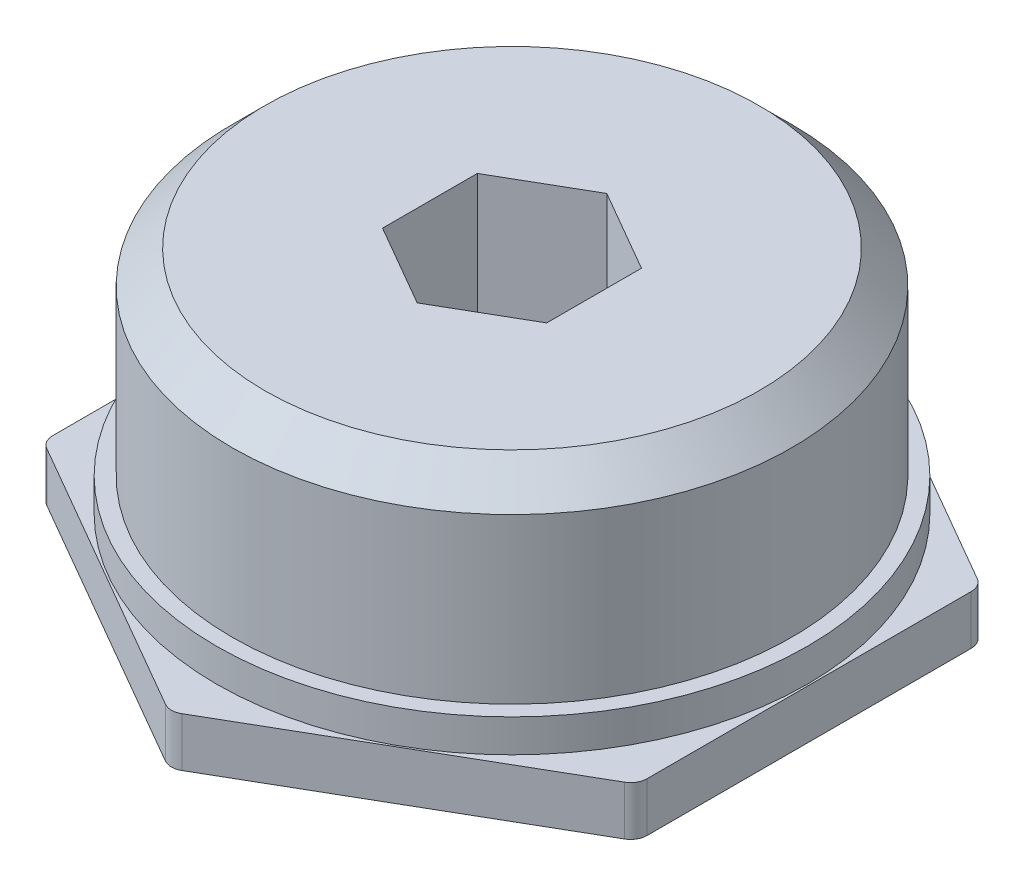
ISO-10303-21;
HEADER;
FILE_DESCRIPTION(('STEP AP214'),'2;1');
FILE_NAME('part.step','',(''),(''),'','','');
FILE_SCHEMA(('AUTOMOTIVE_DESIGN { 1 0 10303 214 1 1 1 1 }'));
ENDSEC;
DATA;
#1=APPLICATION_CONTEXT('core data for automotive mechanical design processes');
#2=APPLICATION_PROTOCOL_DEFINITION('international standard','automotive_design',2000,#1);
#3=PRODUCT_CONTEXT('',#1,'mechanical');
#4=PRODUCT('Part','Part','',(#3));
#5=PRODUCT_RELATED_PRODUCT_CATEGORY('part','',(#4));
#6=PRODUCT_DEFINITION_FORMATION('','',#4);
#7=PRODUCT_DEFINITION_CONTEXT('part definition',#1,'design');
#8=PRODUCT_DEFINITION('design','',#6,#7);
#9=PRODUCT_DEFINITION_SHAPE('','',#8);
#10=(LENGTH_UNIT() NAMED_UNIT(*) SI_UNIT(.MILLI.,.METRE.));
#11=(NAMED_UNIT(*) PLANE_ANGLE_UNIT() SI_UNIT($,.RADIAN.));
#12=(NAMED_UNIT(*) SI_UNIT($,.STERADIAN.) SOLID_ANGLE_UNIT());
#13=UNCERTAINTY_MEASURE_WITH_UNIT(LENGTH_MEASURE(1.E-05),#10,'distance_accuracy_value','');
#14=(GEOMETRIC_REPRESENTATION_CONTEXT(3) GLOBAL_UNCERTAINTY_ASSIGNED_CONTEXT((#13)) GLOBAL_UNIT_ASSIGNED_CONTEXT((#10,
#11,#12)) REPRESENTATION_CONTEXT('',''));
#15=CARTESIAN_POINT('',(0.,0.,0.));
#16=DIRECTION('',(0.,0.,1.));
#17=DIRECTION('',(1.,0.,0.));
#18=AXIS2_PLACEMENT_3D('',#15,#16,#17);
#19=CARTESIAN_POINT('',(0.,31.,0.));
#20=DIRECTION('',(0.,1.,0.));
#21=DIRECTION('',(0.,0.,1.));
#22=AXIS2_PLACEMENT_3D('',#19,#20,#21);
#23=PLANE('',#22);
#24=DIRECTION('',(-0.866025403784439,0.,0.5));
#25=VECTOR('',#24,1.);
#26=CARTESIAN_POINT('',(0.,31.,-10.4500398723322));
#27=LINE('',#26,#25);
#28=CARTESIAN_POINT('',(-0.250000000000002,31.,-10.3057023050348));
#29=VERTEX_POINT('',#28);
#30=CARTESIAN_POINT('',(-8.8,31.,-5.36935750346352));
#31=VERTEX_POINT('',#30);
#32=EDGE_CURVE('E253',#29,#31,#27,.T.);
#33=ORIENTED_EDGE('',*,*,#32,.F.);
#34=CARTESIAN_POINT('',(0.,31.,-9.8726896031426));
#35=DIRECTION('',(0.,1.,0.));
#36=DIRECTION('',(0.,0.,1.));
#37=AXIS2_PLACEMENT_3D('',#34,#35,#36);
#38=CIRCLE('',#37,0.5);
#39=CARTESIAN_POINT('',(0.249999999999997,31.,-10.3057023050348));
#40=VERTEX_POINT('',#39);
#41=EDGE_CURVE('E281',#29,#40,#38,.F.);
#42=ORIENTED_EDGE('',*,*,#41,.T.);
#43=DIRECTION('',(-0.866025403784439,0.,-0.5));
#44=VECTOR('',#43,1.);
#45=CARTESIAN_POINT('',(9.05,31.,-5.22501993616611));
#46=LINE('',#45,#44);
#47=CARTESIAN_POINT('',(8.8,31.,-5.36935750346352));
#48=VERTEX_POINT('',#47);
#49=EDGE_CURVE('E227',#48,#40,#46,.T.);
#50=ORIENTED_EDGE('',*,*,#49,.F.);
#51=CARTESIAN_POINT('',(8.55,31.,-4.9363448015713));
#52=DIRECTION('',(0.,1.,0.));
#53=DIRECTION('',(0.,0.,1.));
#54=AXIS2_PLACEMENT_3D('',#51,#52,#53);
#55=CIRCLE('',#54,0.5);
#56=CARTESIAN_POINT('',(9.05,31.,-4.9363448015713));
#57=VERTEX_POINT('',#56);
#58=EDGE_CURVE('E271',#48,#57,#55,.F.);
#59=ORIENTED_EDGE('',*,*,#58,.T.);
#60=DIRECTION('',(0.,0.,-1.));
#61=VECTOR('',#60,1.);
#62=CARTESIAN_POINT('',(9.05,31.,5.22501993616611));
#63=LINE('',#62,#61);
#64=CARTESIAN_POINT('',(9.05,31.,4.9363448015713));
#65=VERTEX_POINT('',#64);
#66=EDGE_CURVE('E235',#65,#57,#63,.T.);
#67=ORIENTED_EDGE('',*,*,#66,.F.);
#68=CARTESIAN_POINT('',(8.55,31.,4.9363448015713));
#69=DIRECTION('',(0.,1.,0.));
#70=DIRECTION('',(0.,0.,1.));
#71=AXIS2_PLACEMENT_3D('',#68,#69,#70);
#72=CIRCLE('',#71,0.5);
#73=CARTESIAN_POINT('',(8.8,31.,5.36935750346352));
#74=VERTEX_POINT('',#73);
#75=EDGE_CURVE('E273',#65,#74,#72,.F.);
#76=ORIENTED_EDGE('',*,*,#75,.T.);
#77=DIRECTION('',(0.866025403784439,0.,-0.5));
#78=VECTOR('',#77,1.);
#79=CARTESIAN_POINT('',(0.,31.,10.4500398723322));
#80=LINE('',#79,#78);
#81=CARTESIAN_POINT('',(0.249999999999999,31.,10.3057023050348));
#82=VERTEX_POINT('',#81);
#83=EDGE_CURVE('E262',#82,#74,#80,.T.);
#84=ORIENTED_EDGE('',*,*,#83,.F.);
#85=CARTESIAN_POINT('',(0.,31.,9.8726896031426));
#86=DIRECTION('',(0.,1.,0.));
#87=DIRECTION('',(0.,0.,1.));
#88=AXIS2_PLACEMENT_3D('',#85,#86,#87);
#89=CIRCLE('',#88,0.5);
#90=CARTESIAN_POINT('',(-0.249999999999999,31.,10.3057023050348));
#91=VERTEX_POINT('',#90);
#92=EDGE_CURVE('E275',#82,#91,#89,.F.);
#93=ORIENTED_EDGE('',*,*,#92,.T.);
#94=DIRECTION('',(0.866025403784439,0.,0.5));
#95=VECTOR('',#94,1.);
#96=CARTESIAN_POINT('',(-9.05,31.,5.22501993616611));
#97=LINE('',#96,#95);
#98=CARTESIAN_POINT('',(-8.8,31.,5.36935750346352));
#99=VERTEX_POINT('',#98);
#100=EDGE_CURVE('E259',#99,#91,#97,.T.);
#101=ORIENTED_EDGE('',*,*,#100,.F.);
#102=CARTESIAN_POINT('',(-8.55,31.,4.9363448015713));
#103=DIRECTION('',(0.,1.,0.));
#104=DIRECTION('',(0.,0.,1.));
#105=AXIS2_PLACEMENT_3D('',#102,#103,#104);
#106=CIRCLE('',#105,0.5);
#107=CARTESIAN_POINT('',(-9.05,31.,4.9363448015713));
#108=VERTEX_POINT('',#107);
#109=EDGE_CURVE('E277',#99,#108,#106,.F.);
#110=ORIENTED_EDGE('',*,*,#109,.T.);
#111=DIRECTION('',(0.,0.,1.));
#112=VECTOR('',#111,1.);
#113=CARTESIAN_POINT('',(-9.05,31.,-5.22501993616612));
#114=LINE('',#113,#112);
#115=CARTESIAN_POINT('',(-9.05,31.,-4.9363448015713));
#116=VERTEX_POINT('',#115);
#117=EDGE_CURVE('E256',#116,#108,#114,.T.);
#118=ORIENTED_EDGE('',*,*,#117,.F.);
#119=CARTESIAN_POINT('',(-8.55,31.,-4.9363448015713));
#120=DIRECTION('',(0.,1.,0.));
#121=DIRECTION('',(0.,0.,1.));
#122=AXIS2_PLACEMENT_3D('',#119,#120,#121);
#123=CIRCLE('',#122,0.5);
#124=EDGE_CURVE('E279',#116,#31,#123,.F.);
#125=ORIENTED_EDGE('',*,*,#124,.T.);
#126=EDGE_LOOP('',(#33,#42,#50,#59,#67,#76,#84,#93,#101,#110,#118,#125));
#127=FACE_BOUND('',#126,.T.);
#128=DIRECTION('',(-0.866025403784439,0.,-0.5));
#129=VECTOR('',#128,1.);
#130=CARTESIAN_POINT('',(2.5,31.,-1.44337567297407));
#131=LINE('',#130,#129);
#132=CARTESIAN_POINT('',(2.5,31.,-1.44337567297407));
#133=VERTEX_POINT('',#132);
#134=CARTESIAN_POINT('',(0.,31.,-2.88675134594813));
#135=VERTEX_POINT('',#134);
#136=EDGE_CURVE('E59',#133,#135,#131,.T.);
#137=ORIENTED_EDGE('',*,*,#136,.T.);
#138=DIRECTION('',(-0.866025403784439,0.,0.5));
#139=VECTOR('',#138,1.);
#140=CARTESIAN_POINT('',(0.,31.,-2.88675134594813));
#141=LINE('',#140,#139);
#142=CARTESIAN_POINT('',(-2.5,31.,-1.44337567297406));
#143=VERTEX_POINT('',#142);
#144=EDGE_CURVE('E184',#135,#143,#141,.T.);
#145=ORIENTED_EDGE('',*,*,#144,.T.);
#146=DIRECTION('',(0.,0.,1.));
#147=VECTOR('',#146,1.);
#148=CARTESIAN_POINT('',(-2.5,31.,-1.44337567297406));
#149=LINE('',#148,#147);
#150=CARTESIAN_POINT('',(-2.5,31.,1.44337567297407));
#151=VERTEX_POINT('',#150);
#152=EDGE_CURVE('E203',#143,#151,#149,.T.);
#153=ORIENTED_EDGE('',*,*,#152,.T.);
#154=DIRECTION('',(0.866025403784439,0.,0.5));
#155=VECTOR('',#154,1.);
#156=CARTESIAN_POINT('',(-2.5,31.,1.44337567297407));
#157=LINE('',#156,#155);
#158=CARTESIAN_POINT('',(0.,31.,2.88675134594813));
#159=VERTEX_POINT('',#158);
#160=EDGE_CURVE('E206',#151,#159,#157,.T.);
#161=ORIENTED_EDGE('',*,*,#160,.T.);
#162=DIRECTION('',(0.866025403784439,0.,-0.5));
#163=VECTOR('',#162,1.);
#164=CARTESIAN_POINT('',(0.,31.,2.88675134594813));
#165=LINE('',#164,#163);
#166=CARTESIAN_POINT('',(2.5,31.,1.44337567297406));
#167=VERTEX_POINT('',#166);
#168=EDGE_CURVE('E209',#159,#167,#165,.T.);
#169=ORIENTED_EDGE('',*,*,#168,.T.);
#170=DIRECTION('',(0.,0.,-1.));
#171=VECTOR('',#170,1.);
#172=CARTESIAN_POINT('',(2.5,31.,1.44337567297406));
#173=LINE('',#172,#171);
#174=EDGE_CURVE('E178',#167,#133,#173,.T.);
#175=ORIENTED_EDGE('',*,*,#174,.T.);
#176=EDGE_LOOP('',(#137,#145,#153,#161,#169,#175));
#177=FACE_BOUND('',#176,.T.);
#178=ADVANCED_FACE('F43',(#127,#177),#23,.F.);
#179=CARTESIAN_POINT('',(0.,39.5,0.));
#180=DIRECTION('',(0.,1.,0.));
#181=DIRECTION('',(0.,0.,1.));
#182=AXIS2_PLACEMENT_3D('',#179,#180,#181);
#183=PLANE('',#182);
#184=CARTESIAN_POINT('',(0.,39.5,0.));
#185=DIRECTION('',(0.,1.,0.));
#186=DIRECTION('',(0.,0.,1.));
#187=AXIS2_PLACEMENT_3D('',#184,#185,#186);
#188=CIRCLE('',#187,7.52499999999999);
#189=CARTESIAN_POINT('',(0.,39.5,7.52499999999999));
#190=VERTEX_POINT('',#189);
#191=EDGE_CURVE('E52',#190,#190,#188,.T.);
#192=ORIENTED_EDGE('',*,*,#191,.T.);
#193=EDGE_LOOP('',(#192));
#194=FACE_BOUND('',#193,.T.);
#195=DIRECTION('',(-0.866025403784439,0.,0.5));
#196=VECTOR('',#195,1.);
#197=CARTESIAN_POINT('',(0.,39.5,-2.88675134594813));
#198=LINE('',#197,#196);
#199=CARTESIAN_POINT('',(0.,39.5,-2.88675134594813));
#200=VERTEX_POINT('',#199);
#201=CARTESIAN_POINT('',(-2.5,39.5,-1.44337567297406));
#202=VERTEX_POINT('',#201);
#203=EDGE_CURVE('E177',#200,#202,#198,.T.);
#204=ORIENTED_EDGE('',*,*,#203,.F.);
#205=DIRECTION('',(-0.866025403784439,0.,-0.5));
#206=VECTOR('',#205,1.);
#207=CARTESIAN_POINT('',(2.5,39.5,-1.44337567297407));
#208=LINE('',#207,#206);
#209=CARTESIAN_POINT('',(2.5,39.5,-1.44337567297407));
#210=VERTEX_POINT('',#209);
#211=EDGE_CURVE('E169',#210,#200,#208,.T.);
#212=ORIENTED_EDGE('',*,*,#211,.F.);
#213=DIRECTION('',(0.,0.,-1.));
#214=VECTOR('',#213,1.);
#215=CARTESIAN_POINT('',(2.5,39.5,1.44337567297406));
#216=LINE('',#215,#214);
#217=CARTESIAN_POINT('',(2.5,39.5,1.44337567297406));
#218=VERTEX_POINT('',#217);
#219=EDGE_CURVE('E199',#218,#210,#216,.T.);
#220=ORIENTED_EDGE('',*,*,#219,.F.);
#221=DIRECTION('',(0.866025403784439,0.,-0.5));
#222=VECTOR('',#221,1.);
#223=CARTESIAN_POINT('',(0.,39.5,2.88675134594813));
#224=LINE('',#223,#222);
#225=CARTESIAN_POINT('',(0.,39.5,2.88675134594813));
#226=VERTEX_POINT('',#225);
#227=EDGE_CURVE('E197',#226,#218,#224,.T.);
#228=ORIENTED_EDGE('',*,*,#227,.F.);
#229=DIRECTION('',(0.866025403784439,0.,0.5));
#230=VECTOR('',#229,1.);
#231=CARTESIAN_POINT('',(-2.5,39.5,1.44337567297407));
#232=LINE('',#231,#230);
#233=CARTESIAN_POINT('',(-2.5,39.5,1.44337567297407));
#234=VERTEX_POINT('',#233);
#235=EDGE_CURVE('E193',#234,#226,#232,.T.);
#236=ORIENTED_EDGE('',*,*,#235,.F.);
#237=DIRECTION('',(0.,0.,1.));
#238=VECTOR('',#237,1.);
#239=CARTESIAN_POINT('',(-2.5,39.5,-1.44337567297406));
#240=LINE('',#239,#238);
#241=EDGE_CURVE('E191',#202,#234,#240,.T.);
#242=ORIENTED_EDGE('',*,*,#241,.F.);
#243=EDGE_LOOP('',(#204,#212,#220,#228,#236,#242));
#244=FACE_BOUND('',#243,.T.);
#245=ADVANCED_FACE('F189',(#194,#244),#183,.T.);
#246=CARTESIAN_POINT('',(9.05,32.5,-5.22501993616611));
#247=DIRECTION('',(-0.5,0.,0.866025403784439));
#248=DIRECTION('',(0.866025403784439,0.,0.5));
#249=AXIS2_PLACEMENT_3D('',#246,#247,#248);
#250=PLANE('',#249);
#251=ORIENTED_EDGE('',*,*,#49,.T.);
#252=DIRECTION('',(0.,-1.,0.));
#253=VECTOR('',#252,1.);
#254=CARTESIAN_POINT('',(0.249999999999999,32.5,-10.3057023050348));
#255=LINE('',#254,#253);
#256=CARTESIAN_POINT('',(0.249999999999997,32.5,-10.3057023050348));
#257=VERTEX_POINT('',#256);
#258=EDGE_CURVE('E286',#40,#257,#255,.F.);
#259=ORIENTED_EDGE('',*,*,#258,.T.);
#260=DIRECTION('',(-0.866025403784439,0.,-0.5));
#261=VECTOR('',#260,1.);
#262=CARTESIAN_POINT('',(9.05,32.5,-5.22501993616611));
#263=LINE('',#262,#261);
#264=CARTESIAN_POINT('',(8.8,32.5,-5.36935750346352));
#265=VERTEX_POINT('',#264);
#266=EDGE_CURVE('E231',#265,#257,#263,.T.);
#267=ORIENTED_EDGE('',*,*,#266,.F.);
#268=DIRECTION('',(0.,-1.,0.));
#269=VECTOR('',#268,1.);
#270=CARTESIAN_POINT('',(8.8,32.5,-5.36935750346352));
#271=LINE('',#270,#269);
#272=EDGE_CURVE('E283',#265,#48,#271,.T.);
#273=ORIENTED_EDGE('',*,*,#272,.T.);
#274=EDGE_LOOP('',(#251,#259,#267,#273));
#275=FACE_BOUND('',#274,.T.);
#276=ADVANCED_FACE('F340',(#275),#250,.F.);
#277=CARTESIAN_POINT('',(0.,32.5,-10.4500398723322));
#278=DIRECTION('',(0.5,0.,0.866025403784439));
#279=DIRECTION('',(0.866025403784439,0.,-0.5));
#280=AXIS2_PLACEMENT_3D('',#277,#278,#279);
#281=PLANE('',#280);
#282=DIRECTION('',(-0.866025403784439,0.,0.5));
#283=VECTOR('',#282,1.);
#284=CARTESIAN_POINT('',(0.,32.5,-10.4500398723322));
#285=LINE('',#284,#283);
#286=CARTESIAN_POINT('',(-0.250000000000002,32.5,-10.3057023050348));
#287=VERTEX_POINT('',#286);
#288=CARTESIAN_POINT('',(-8.8,32.5,-5.36935750346352));
#289=VERTEX_POINT('',#288);
#290=EDGE_CURVE('E234',#287,#289,#285,.T.);
#291=ORIENTED_EDGE('',*,*,#290,.F.);
#292=DIRECTION('',(0.,-1.,0.));
#293=VECTOR('',#292,1.);
#294=CARTESIAN_POINT('',(-0.250000000000002,32.5,-10.3057023050348));
#295=LINE('',#294,#293);
#296=EDGE_CURVE('E268',#287,#29,#295,.T.);
#297=ORIENTED_EDGE('',*,*,#296,.T.);
#298=ORIENTED_EDGE('',*,*,#32,.T.);
#299=DIRECTION('',(0.,-1.,0.));
#300=VECTOR('',#299,1.);
#301=CARTESIAN_POINT('',(-8.8,32.5,-5.36935750346352));
#302=LINE('',#301,#300);
#303=EDGE_CURVE('E250',#31,#289,#302,.F.);
#304=ORIENTED_EDGE('',*,*,#303,.T.);
#305=EDGE_LOOP('',(#291,#297,#298,#304));
#306=FACE_BOUND('',#305,.T.);
#307=ADVANCED_FACE('F363',(#306),#281,.F.);
#308=CARTESIAN_POINT('',(-9.05,32.5,-5.22501993616612));
#309=DIRECTION('',(1.,0.,0.));
#310=DIRECTION('',(0.,0.,-1.));
#311=AXIS2_PLACEMENT_3D('',#308,#309,#310);
#312=PLANE('',#311);
#313=DIRECTION('',(0.,0.,1.));
#314=VECTOR('',#313,1.);
#315=CARTESIAN_POINT('',(-9.05,32.5,-5.22501993616612));
#316=LINE('',#315,#314);
#317=CARTESIAN_POINT('',(-9.05,32.5,-4.9363448015713));
#318=VERTEX_POINT('',#317);
#319=CARTESIAN_POINT('',(-9.05,32.5,4.9363448015713));
#320=VERTEX_POINT('',#319);
#321=EDGE_CURVE('E238',#318,#320,#316,.T.);
#322=ORIENTED_EDGE('',*,*,#321,.F.);
#323=DIRECTION('',(0.,-1.,0.));
#324=VECTOR('',#323,1.);
#325=CARTESIAN_POINT('',(-9.05,32.5,-4.9363448015713));
#326=LINE('',#325,#324);
#327=EDGE_CURVE('E302',#318,#116,#326,.T.);
#328=ORIENTED_EDGE('',*,*,#327,.T.);
#329=ORIENTED_EDGE('',*,*,#117,.T.);
#330=DIRECTION('',(0.,-1.,0.));
#331=VECTOR('',#330,1.);
#332=CARTESIAN_POINT('',(-9.05,32.5,4.9363448015713));
#333=LINE('',#332,#331);
#334=EDGE_CURVE('E300',#108,#320,#333,.F.);
#335=ORIENTED_EDGE('',*,*,#334,.T.);
#336=EDGE_LOOP('',(#322,#328,#329,#335));
#337=FACE_BOUND('',#336,.T.);
#338=ADVANCED_FACE('F359',(#337),#312,.F.);
#339=CARTESIAN_POINT('',(-9.05,32.5,5.22501993616611));
#340=DIRECTION('',(0.5,0.,-0.866025403784439));
#341=DIRECTION('',(-0.866025403784439,0.,-0.5));
#342=AXIS2_PLACEMENT_3D('',#339,#340,#341);
#343=PLANE('',#342);
#344=DIRECTION('',(0.866025403784439,0.,0.5));
#345=VECTOR('',#344,1.);
#346=CARTESIAN_POINT('',(-9.05,32.5,5.22501993616611));
#347=LINE('',#346,#345);
#348=CARTESIAN_POINT('',(-8.8,32.5,5.36935750346352));
#349=VERTEX_POINT('',#348);
#350=CARTESIAN_POINT('',(-0.249999999999999,32.5,10.3057023050348));
#351=VERTEX_POINT('',#350);
#352=EDGE_CURVE('E241',#349,#351,#347,.T.);
#353=ORIENTED_EDGE('',*,*,#352,.F.);
#354=DIRECTION('',(0.,-1.,0.));
#355=VECTOR('',#354,1.);
#356=CARTESIAN_POINT('',(-8.8,32.5,5.36935750346352));
#357=LINE('',#356,#355);
#358=EDGE_CURVE('E307',#349,#99,#357,.T.);
#359=ORIENTED_EDGE('',*,*,#358,.T.);
#360=ORIENTED_EDGE('',*,*,#100,.T.);
#361=DIRECTION('',(0.,-1.,0.));
#362=VECTOR('',#361,1.);
#363=CARTESIAN_POINT('',(-0.25,32.5,10.3057023050348));
#364=LINE('',#363,#362);
#365=EDGE_CURVE('E305',#91,#351,#364,.F.);
#366=ORIENTED_EDGE('',*,*,#365,.T.);
#367=EDGE_LOOP('',(#353,#359,#360,#366));
#368=FACE_BOUND('',#367,.T.);
#369=ADVANCED_FACE('F355',(#368),#343,.F.);
#370=CARTESIAN_POINT('',(0.,32.5,10.4500398723322));
#371=DIRECTION('',(-0.5,0.,-0.866025403784439));
#372=DIRECTION('',(-0.866025403784439,0.,0.5));
#373=AXIS2_PLACEMENT_3D('',#370,#371,#372);
#374=PLANE('',#373);
#375=DIRECTION('',(0.866025403784439,0.,-0.5));
#376=VECTOR('',#375,1.);
#377=CARTESIAN_POINT('',(0.,32.5,10.4500398723322));
#378=LINE('',#377,#376);
#379=CARTESIAN_POINT('',(0.249999999999999,32.5,10.3057023050348));
#380=VERTEX_POINT('',#379);
#381=CARTESIAN_POINT('',(8.8,32.5,5.36935750346352));
#382=VERTEX_POINT('',#381);
#383=EDGE_CURVE('E244',#380,#382,#378,.T.);
#384=ORIENTED_EDGE('',*,*,#383,.F.);
#385=DIRECTION('',(0.,-1.,0.));
#386=VECTOR('',#385,1.);
#387=CARTESIAN_POINT('',(0.25,32.5,10.3057023050348));
#388=LINE('',#387,#386);
#389=EDGE_CURVE('E312',#380,#82,#388,.T.);
#390=ORIENTED_EDGE('',*,*,#389,.T.);
#391=ORIENTED_EDGE('',*,*,#83,.T.);
#392=DIRECTION('',(0.,-1.,0.));
#393=VECTOR('',#392,1.);
#394=CARTESIAN_POINT('',(8.8,32.5,5.36935750346352));
#395=LINE('',#394,#393);
#396=EDGE_CURVE('E310',#74,#382,#395,.F.);
#397=ORIENTED_EDGE('',*,*,#396,.T.);
#398=EDGE_LOOP('',(#384,#390,#391,#397));
#399=FACE_BOUND('',#398,.T.);
#400=ADVANCED_FACE('F351',(#399),#374,.F.);
#401=CARTESIAN_POINT('',(9.05,32.5,5.22501993616611));
#402=DIRECTION('',(-1.,0.,0.));
#403=DIRECTION('',(0.,0.,1.));
#404=AXIS2_PLACEMENT_3D('',#401,#402,#403);
#405=PLANE('',#404);
#406=DIRECTION('',(0.,0.,-1.));
#407=VECTOR('',#406,1.);
#408=CARTESIAN_POINT('',(9.05,32.5,5.22501993616611));
#409=LINE('',#408,#407);
#410=CARTESIAN_POINT('',(9.05,32.5,4.9363448015713));
#411=VERTEX_POINT('',#410);
#412=CARTESIAN_POINT('',(9.05,32.5,-4.9363448015713));
#413=VERTEX_POINT('',#412);
#414=EDGE_CURVE('E247',#411,#413,#409,.T.);
#415=ORIENTED_EDGE('',*,*,#414,.F.);
#416=DIRECTION('',(0.,-1.,0.));
#417=VECTOR('',#416,1.);
#418=CARTESIAN_POINT('',(9.05,32.5,4.9363448015713));
#419=LINE('',#418,#417);
#420=EDGE_CURVE('E230',#411,#65,#419,.T.);
#421=ORIENTED_EDGE('',*,*,#420,.T.);
#422=ORIENTED_EDGE('',*,*,#66,.T.);
#423=DIRECTION('',(0.,-1.,0.));
#424=VECTOR('',#423,1.);
#425=CARTESIAN_POINT('',(9.05,32.5,-4.9363448015713));
#426=LINE('',#425,#424);
#427=EDGE_CURVE('E315',#57,#413,#426,.F.);
#428=ORIENTED_EDGE('',*,*,#427,.T.);
#429=EDGE_LOOP('',(#415,#421,#422,#428));
#430=FACE_BOUND('',#429,.T.);
#431=ADVANCED_FACE('F348',(#430),#405,.F.);
#432=CARTESIAN_POINT('',(0.,32.5,0.));
#433=DIRECTION('',(0.,1.,0.));
#434=DIRECTION('',(0.,0.,1.));
#435=AXIS2_PLACEMENT_3D('',#432,#433,#434);
#436=PLANE('',#435);
#437=CARTESIAN_POINT('',(0.,32.5,0.));
#438=DIRECTION('',(0.,1.,0.));
#439=DIRECTION('',(0.,0.,1.));
#440=AXIS2_PLACEMENT_3D('',#437,#438,#439);
#441=CIRCLE('',#440,9.00000000000006);
#442=CARTESIAN_POINT('',(0.,32.5,9.00000000000006));
#443=VERTEX_POINT('',#442);
#444=EDGE_CURVE('E224',#443,#443,#441,.T.);
#445=ORIENTED_EDGE('',*,*,#444,.F.);
#446=EDGE_LOOP('',(#445));
#447=FACE_BOUND('',#446,.T.);
#448=ORIENTED_EDGE('',*,*,#266,.T.);
#449=CARTESIAN_POINT('',(0.,32.5,-9.8726896031426));
#450=DIRECTION('',(0.,1.,0.));
#451=DIRECTION('',(0.,0.,1.));
#452=AXIS2_PLACEMENT_3D('',#449,#450,#451);
#453=CIRCLE('',#452,0.5);
#454=EDGE_CURVE('E298',#257,#287,#453,.T.);
#455=ORIENTED_EDGE('',*,*,#454,.T.);
#456=ORIENTED_EDGE('',*,*,#290,.T.);
#457=CARTESIAN_POINT('',(-8.55,32.5,-4.9363448015713));
#458=DIRECTION('',(0.,1.,0.));
#459=DIRECTION('',(0.,0.,1.));
#460=AXIS2_PLACEMENT_3D('',#457,#458,#459);
#461=CIRCLE('',#460,0.5);
#462=EDGE_CURVE('E296',#289,#318,#461,.T.);
#463=ORIENTED_EDGE('',*,*,#462,.T.);
#464=ORIENTED_EDGE('',*,*,#321,.T.);
#465=CARTESIAN_POINT('',(-8.55,32.5,4.9363448015713));
#466=DIRECTION('',(0.,1.,0.));
#467=DIRECTION('',(0.,0.,1.));
#468=AXIS2_PLACEMENT_3D('',#465,#466,#467);
#469=CIRCLE('',#468,0.5);
#470=EDGE_CURVE('E294',#320,#349,#469,.T.);
#471=ORIENTED_EDGE('',*,*,#470,.T.);
#472=ORIENTED_EDGE('',*,*,#352,.T.);
#473=CARTESIAN_POINT('',(0.,32.5,9.8726896031426));
#474=DIRECTION('',(0.,1.,0.));
#475=DIRECTION('',(0.,0.,1.));
#476=AXIS2_PLACEMENT_3D('',#473,#474,#475);
#477=CIRCLE('',#476,0.5);
#478=EDGE_CURVE('E292',#351,#380,#477,.T.);
#479=ORIENTED_EDGE('',*,*,#478,.T.);
#480=ORIENTED_EDGE('',*,*,#383,.T.);
#481=CARTESIAN_POINT('',(8.55,32.5,4.9363448015713));
#482=DIRECTION('',(0.,1.,0.));
#483=DIRECTION('',(0.,0.,1.));
#484=AXIS2_PLACEMENT_3D('',#481,#482,#483);
#485=CIRCLE('',#484,0.5);
#486=EDGE_CURVE('E290',#382,#411,#485,.T.);
#487=ORIENTED_EDGE('',*,*,#486,.T.);
#488=ORIENTED_EDGE('',*,*,#414,.T.);
#489=CARTESIAN_POINT('',(8.55,32.5,-4.9363448015713));
#490=DIRECTION('',(0.,1.,0.));
#491=DIRECTION('',(0.,0.,1.));
#492=AXIS2_PLACEMENT_3D('',#489,#490,#491);
#493=CIRCLE('',#492,0.5);
#494=EDGE_CURVE('E288',#413,#265,#493,.T.);
#495=ORIENTED_EDGE('',*,*,#494,.T.);
#496=EDGE_LOOP('',(#448,#455,#456,#463,#464,#471,#472,#479,#480,#487,#488,#495));
#497=FACE_BOUND('',#496,.T.);
#498=ADVANCED_FACE('F346',(#447,#497),#436,.T.);
#499=CARTESIAN_POINT('',(0.,32.5,-9.8726896031426));
#500=DIRECTION('',(0.,-1.,0.));
#501=DIRECTION('',(0.,0.,-1.));
#502=AXIS2_PLACEMENT_3D('',#499,#500,#501);
#503=CYLINDRICAL_SURFACE('',#502,0.5);
#504=ORIENTED_EDGE('',*,*,#454,.F.);
#505=ORIENTED_EDGE('',*,*,#258,.F.);
#506=ORIENTED_EDGE('',*,*,#41,.F.);
#507=ORIENTED_EDGE('',*,*,#296,.F.);
#508=EDGE_LOOP('',(#504,#505,#506,#507));
#509=FACE_BOUND('',#508,.T.);
#510=ADVANCED_FACE('F371',(#509),#503,.T.);
#511=CARTESIAN_POINT('',(-8.55,32.5,-4.9363448015713));
#512=DIRECTION('',(0.,-1.,0.));
#513=DIRECTION('',(0.,0.,-1.));
#514=AXIS2_PLACEMENT_3D('',#511,#512,#513);
#515=CYLINDRICAL_SURFACE('',#514,0.5);
#516=ORIENTED_EDGE('',*,*,#462,.F.);
#517=ORIENTED_EDGE('',*,*,#303,.F.);
#518=ORIENTED_EDGE('',*,*,#124,.F.);
#519=ORIENTED_EDGE('',*,*,#327,.F.);
#520=EDGE_LOOP('',(#516,#517,#518,#519));
#521=FACE_BOUND('',#520,.T.);
#522=ADVANCED_FACE('F374',(#521),#515,.T.);
#523=CARTESIAN_POINT('',(-8.55,32.5,4.9363448015713));
#524=DIRECTION('',(0.,-1.,0.));
#525=DIRECTION('',(0.,0.,-1.));
#526=AXIS2_PLACEMENT_3D('',#523,#524,#525);
#527=CYLINDRICAL_SURFACE('',#526,0.5);
#528=ORIENTED_EDGE('',*,*,#470,.F.);
#529=ORIENTED_EDGE('',*,*,#334,.F.);
#530=ORIENTED_EDGE('',*,*,#109,.F.);
#531=ORIENTED_EDGE('',*,*,#358,.F.);
#532=EDGE_LOOP('',(#528,#529,#530,#531));
#533=FACE_BOUND('',#532,.T.);
#534=ADVANCED_FACE('F378',(#533),#527,.T.);
#535=CARTESIAN_POINT('',(0.,32.5,9.8726896031426));
#536=DIRECTION('',(0.,-1.,0.));
#537=DIRECTION('',(0.,0.,-1.));
#538=AXIS2_PLACEMENT_3D('',#535,#536,#537);
#539=CYLINDRICAL_SURFACE('',#538,0.5);
#540=ORIENTED_EDGE('',*,*,#478,.F.);
#541=ORIENTED_EDGE('',*,*,#365,.F.);
#542=ORIENTED_EDGE('',*,*,#92,.F.);
#543=ORIENTED_EDGE('',*,*,#389,.F.);
#544=EDGE_LOOP('',(#540,#541,#542,#543));
#545=FACE_BOUND('',#544,.T.);
#546=ADVANCED_FACE('F382',(#545),#539,.T.);
#547=CARTESIAN_POINT('',(8.55,32.5,4.9363448015713));
#548=DIRECTION('',(0.,-1.,0.));
#549=DIRECTION('',(0.,0.,-1.));
#550=AXIS2_PLACEMENT_3D('',#547,#548,#549);
#551=CYLINDRICAL_SURFACE('',#550,0.5);
#552=ORIENTED_EDGE('',*,*,#486,.F.);
#553=ORIENTED_EDGE('',*,*,#396,.F.);
#554=ORIENTED_EDGE('',*,*,#75,.F.);
#555=ORIENTED_EDGE('',*,*,#420,.F.);
#556=EDGE_LOOP('',(#552,#553,#554,#555));
#557=FACE_BOUND('',#556,.T.);
#558=ADVANCED_FACE('F386',(#557),#551,.T.);
#559=CARTESIAN_POINT('',(8.55,32.5,-4.9363448015713));
#560=DIRECTION('',(0.,-1.,0.));
#561=DIRECTION('',(0.,0.,-1.));
#562=AXIS2_PLACEMENT_3D('',#559,#560,#561);
#563=CYLINDRICAL_SURFACE('',#562,0.5);
#564=ORIENTED_EDGE('',*,*,#494,.F.);
#565=ORIENTED_EDGE('',*,*,#427,.F.);
#566=ORIENTED_EDGE('',*,*,#58,.F.);
#567=ORIENTED_EDGE('',*,*,#272,.F.);
#568=EDGE_LOOP('',(#564,#565,#566,#567));
#569=FACE_BOUND('',#568,.T.);
#570=ADVANCED_FACE('F389',(#569),#563,.T.);
#571=CARTESIAN_POINT('',(0.,33.5,0.));
#572=DIRECTION('',(0.,-1.,0.));
#573=DIRECTION('',(0.,0.,-1.));
#574=AXIS2_PLACEMENT_3D('',#571,#572,#573);
#575=CYLINDRICAL_SURFACE('',#574,9.00000000000006);
#576=CARTESIAN_POINT('',(0.,33.5,0.));
#577=DIRECTION('',(0.,1.,0.));
#578=DIRECTION('',(0.,0.,1.));
#579=AXIS2_PLACEMENT_3D('',#576,#577,#578);
#580=CIRCLE('',#579,9.00000000000006);
#581=CARTESIAN_POINT('',(0.,33.5,9.00000000000006));
#582=VERTEX_POINT('',#581);
#583=EDGE_CURVE('E185',#582,#582,#580,.T.);
#584=ORIENTED_EDGE('',*,*,#583,.F.);
#585=EDGE_LOOP('',(#584));
#586=FACE_BOUND('',#585,.T.);
#587=ORIENTED_EDGE('',*,*,#444,.T.);
#588=EDGE_LOOP('',(#587));
#589=FACE_BOUND('',#588,.T.);
#590=ADVANCED_FACE('F392',(#586,#589),#575,.T.);
#591=CARTESIAN_POINT('',(0.,33.5,0.));
#592=DIRECTION('',(0.,1.,0.));
#593=DIRECTION('',(0.,0.,1.));
#594=AXIS2_PLACEMENT_3D('',#591,#592,#593);
#595=PLANE('',#594);
#596=CARTESIAN_POINT('',(0.,33.5,0.));
#597=DIRECTION('',(0.,1.,0.));
#598=DIRECTION('',(0.,0.,1.));
#599=AXIS2_PLACEMENT_3D('',#596,#597,#598);
#600=CIRCLE('',#599,8.525);
#601=CARTESIAN_POINT('',(0.,33.5,8.525));
#602=VERTEX_POINT('',#601);
#603=EDGE_CURVE('E221',#602,#602,#600,.T.);
#604=ORIENTED_EDGE('',*,*,#603,.F.);
#605=EDGE_LOOP('',(#604));
#606=FACE_BOUND('',#605,.T.);
#607=ORIENTED_EDGE('',*,*,#583,.T.);
#608=EDGE_LOOP('',(#607));
#609=FACE_BOUND('',#608,.T.);
#610=ADVANCED_FACE('F331',(#606,#609),#595,.T.);
#611=CARTESIAN_POINT('',(0.,37.5,0.));
#612=DIRECTION('',(0.,-1.,0.));
#613=DIRECTION('',(0.,0.,-1.));
#614=AXIS2_PLACEMENT_3D('',#611,#612,#613);
#615=CYLINDRICAL_SURFACE('',#614,8.525);
#616=CARTESIAN_POINT('',(0.,38.5,0.));
#617=DIRECTION('',(0.,1.,0.));
#618=DIRECTION('',(0.,0.,1.));
#619=AXIS2_PLACEMENT_3D('',#616,#617,#618);
#620=CIRCLE('',#619,8.525);
#621=CARTESIAN_POINT('',(0.,38.5,8.525));
#622=VERTEX_POINT('',#621);
#623=EDGE_CURVE('E11',#622,#622,#620,.F.);
#624=ORIENTED_EDGE('',*,*,#623,.T.);
#625=EDGE_LOOP('',(#624));
#626=FACE_BOUND('',#625,.T.);
#627=ORIENTED_EDGE('',*,*,#603,.T.);
#628=EDGE_LOOP('',(#627));
#629=FACE_BOUND('',#628,.T.);
#630=ADVANCED_FACE('F323',(#626,#629),#615,.T.);
#631=CARTESIAN_POINT('',(0.,39.5,0.));
#632=DIRECTION('',(0.,-1.,0.));
#633=DIRECTION('',(0.,0.,-1.));
#634=AXIS2_PLACEMENT_3D('',#631,#632,#633);
#635=CONICAL_SURFACE('',#634,7.52499999999999,0.785398163397444);
#636=ORIENTED_EDGE('',*,*,#623,.F.);
#637=EDGE_LOOP('',(#636));
#638=FACE_BOUND('',#637,.T.);
#639=ORIENTED_EDGE('',*,*,#191,.F.);
#640=EDGE_LOOP('',(#639));
#641=FACE_BOUND('',#640,.T.);
#642=ADVANCED_FACE('F46',(#638,#641),#635,.T.);
#643=CARTESIAN_POINT('',(2.5,39.5,-1.44337567297407));
#644=DIRECTION('',(-0.5,0.,0.866025403784439));
#645=DIRECTION('',(0.866025403784439,0.,0.5));
#646=AXIS2_PLACEMENT_3D('',#643,#644,#645);
#647=PLANE('',#646);
#648=ORIENTED_EDGE('',*,*,#136,.F.);
#649=DIRECTION('',(0.,-1.,0.));
#650=VECTOR('',#649,1.);
#651=CARTESIAN_POINT('',(2.5,39.5,-1.44337567297407));
#652=LINE('',#651,#650);
#653=EDGE_CURVE('E173',#210,#133,#652,.T.);
#654=ORIENTED_EDGE('',*,*,#653,.F.);
#655=ORIENTED_EDGE('',*,*,#211,.T.);
#656=DIRECTION('',(0.,-1.,0.));
#657=VECTOR('',#656,1.);
#658=CARTESIAN_POINT('',(0.,39.5,-2.88675134594813));
#659=LINE('',#658,#657);
#660=EDGE_CURVE('E172',#200,#135,#659,.T.);
#661=ORIENTED_EDGE('',*,*,#660,.T.);
#662=EDGE_LOOP('',(#648,#654,#655,#661));
#663=FACE_BOUND('',#662,.T.);
#664=ADVANCED_FACE('F171',(#663),#647,.T.);
#665=CARTESIAN_POINT('',(0.,39.5,-2.88675134594813));
#666=DIRECTION('',(0.5,0.,0.866025403784439));
#667=DIRECTION('',(0.866025403784439,0.,-0.5));
#668=AXIS2_PLACEMENT_3D('',#665,#666,#667);
#669=PLANE('',#668);
#670=ORIENTED_EDGE('',*,*,#144,.F.);
#671=ORIENTED_EDGE('',*,*,#660,.F.);
#672=ORIENTED_EDGE('',*,*,#203,.T.);
#673=DIRECTION('',(0.,-1.,0.));
#674=VECTOR('',#673,1.);
#675=CARTESIAN_POINT('',(-2.5,39.5,-1.44337567297406));
#676=LINE('',#675,#674);
#677=EDGE_CURVE('E186',#202,#143,#676,.T.);
#678=ORIENTED_EDGE('',*,*,#677,.T.);
#679=EDGE_LOOP('',(#670,#671,#672,#678));
#680=FACE_BOUND('',#679,.T.);
#681=ADVANCED_FACE('F181',(#680),#669,.T.);
#682=CARTESIAN_POINT('',(-2.5,39.5,-1.44337567297406));
#683=DIRECTION('',(1.,0.,0.));
#684=DIRECTION('',(0.,0.,-1.));
#685=AXIS2_PLACEMENT_3D('',#682,#683,#684);
#686=PLANE('',#685);
#687=ORIENTED_EDGE('',*,*,#152,.F.);
#688=ORIENTED_EDGE('',*,*,#677,.F.);
#689=ORIENTED_EDGE('',*,*,#241,.T.);
#690=DIRECTION('',(0.,-1.,0.));
#691=VECTOR('',#690,1.);
#692=CARTESIAN_POINT('',(-2.5,39.5,1.44337567297407));
#693=LINE('',#692,#691);
#694=EDGE_CURVE('E218',#234,#151,#693,.T.);
#695=ORIENTED_EDGE('',*,*,#694,.T.);
#696=EDGE_LOOP('',(#687,#688,#689,#695));
#697=FACE_BOUND('',#696,.T.);
#698=ADVANCED_FACE('F486',(#697),#686,.T.);
#699=CARTESIAN_POINT('',(-2.5,39.5,1.44337567297407));
#700=DIRECTION('',(0.5,0.,-0.866025403784439));
#701=DIRECTION('',(-0.866025403784439,0.,-0.5));
#702=AXIS2_PLACEMENT_3D('',#699,#700,#701);
#703=PLANE('',#702);
#704=ORIENTED_EDGE('',*,*,#160,.F.);
#705=ORIENTED_EDGE('',*,*,#694,.F.);
#706=ORIENTED_EDGE('',*,*,#235,.T.);
#707=DIRECTION('',(0.,-1.,0.));
#708=VECTOR('',#707,1.);
#709=CARTESIAN_POINT('',(0.,39.5,2.88675134594813));
#710=LINE('',#709,#708);
#711=EDGE_CURVE('E216',#226,#159,#710,.T.);
#712=ORIENTED_EDGE('',*,*,#711,.T.);
#713=EDGE_LOOP('',(#704,#705,#706,#712));
#714=FACE_BOUND('',#713,.T.);
#715=ADVANCED_FACE('F495',(#714),#703,.T.);
#716=CARTESIAN_POINT('',(0.,39.5,2.88675134594813));
#717=DIRECTION('',(-0.5,0.,-0.866025403784439));
#718=DIRECTION('',(-0.866025403784439,0.,0.5));
#719=AXIS2_PLACEMENT_3D('',#716,#717,#718);
#720=PLANE('',#719);
#721=ORIENTED_EDGE('',*,*,#168,.F.);
#722=ORIENTED_EDGE('',*,*,#711,.F.);
#723=ORIENTED_EDGE('',*,*,#227,.T.);
#724=DIRECTION('',(0.,-1.,0.));
#725=VECTOR('',#724,1.);
#726=CARTESIAN_POINT('',(2.5,39.5,1.44337567297406));
#727=LINE('',#726,#725);
#728=EDGE_CURVE('E67',#218,#167,#727,.T.);
#729=ORIENTED_EDGE('',*,*,#728,.T.);
#730=EDGE_LOOP('',(#721,#722,#723,#729));
#731=FACE_BOUND('',#730,.T.);
#732=ADVANCED_FACE('F505',(#731),#720,.T.);
#733=CARTESIAN_POINT('',(2.5,39.5,1.44337567297406));
#734=DIRECTION('',(-1.,0.,0.));
#735=DIRECTION('',(0.,0.,1.));
#736=AXIS2_PLACEMENT_3D('',#733,#734,#735);
#737=PLANE('',#736);
#738=ORIENTED_EDGE('',*,*,#174,.F.);
#739=ORIENTED_EDGE('',*,*,#728,.F.);
#740=ORIENTED_EDGE('',*,*,#219,.T.);
#741=ORIENTED_EDGE('',*,*,#653,.T.);
#742=EDGE_LOOP('',(#738,#739,#740,#741));
#743=FACE_BOUND('',#742,.T.);
#744=ADVANCED_FACE('F515',(#743),#737,.T.);
#745=CLOSED_SHELL('',(#178,#245,#276,#307,#338,#369,#400,#431,#498,#510,#522,#534,#546,#558,
#570,#590,#610,#630,#642,#664,#681,#698,#715,#732,#744));
#746=MANIFOLD_SOLID_BREP('B2',#745);
#747=ADVANCED_BREP_SHAPE_REPRESENTATION('',(#18,#746),#14);
#748=SHAPE_DEFINITION_REPRESENTATION(#9,#747);
ENDSEC;
END-ISO-10303-21;
